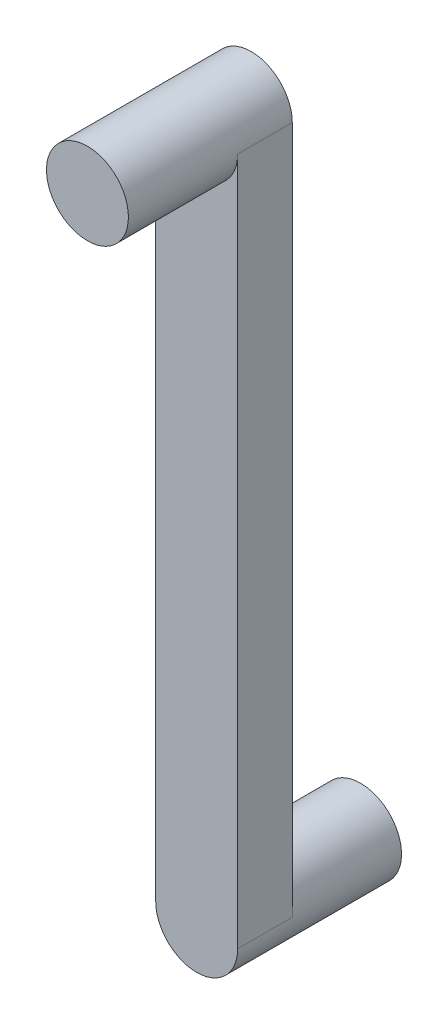
ISO-10303-21;
HEADER;
FILE_DESCRIPTION(('STEP AP214'),'2;1');
FILE_NAME('part.step','',(''),(''),'','','');
FILE_SCHEMA(('AUTOMOTIVE_DESIGN { 1 0 10303 214 1 1 1 1 }'));
ENDSEC;
DATA;
#1=APPLICATION_CONTEXT('core data for automotive mechanical design processes');
#2=APPLICATION_PROTOCOL_DEFINITION('international standard','automotive_design',2000,#1);
#3=PRODUCT_CONTEXT('',#1,'mechanical');
#4=PRODUCT('Part','Part','',(#3));
#5=PRODUCT_RELATED_PRODUCT_CATEGORY('part','',(#4));
#6=PRODUCT_DEFINITION_FORMATION('','',#4);
#7=PRODUCT_DEFINITION_CONTEXT('part definition',#1,'design');
#8=PRODUCT_DEFINITION('design','',#6,#7);
#9=PRODUCT_DEFINITION_SHAPE('','',#8);
#10=(LENGTH_UNIT() NAMED_UNIT(*) SI_UNIT(.MILLI.,.METRE.));
#11=(NAMED_UNIT(*) PLANE_ANGLE_UNIT() SI_UNIT($,.RADIAN.));
#12=(NAMED_UNIT(*) SI_UNIT($,.STERADIAN.) SOLID_ANGLE_UNIT());
#13=UNCERTAINTY_MEASURE_WITH_UNIT(LENGTH_MEASURE(1.E-05),#10,'distance_accuracy_value','');
#14=(GEOMETRIC_REPRESENTATION_CONTEXT(3) GLOBAL_UNCERTAINTY_ASSIGNED_CONTEXT((#13)) GLOBAL_UNIT_ASSIGNED_CONTEXT((#10,
#11,#12)) REPRESENTATION_CONTEXT('',''));
#15=CARTESIAN_POINT('',(0.,0.,0.));
#16=DIRECTION('',(0.,0.,1.));
#17=DIRECTION('',(1.,0.,0.));
#18=AXIS2_PLACEMENT_3D('',#15,#16,#17);
#19=CARTESIAN_POINT('',(0.,-126.,0.));
#20=DIRECTION('',(0.,0.,1.));
#21=DIRECTION('',(1.,0.,0.));
#22=AXIS2_PLACEMENT_3D('',#19,#20,#21);
#23=PLANE('',#22);
#24=CARTESIAN_POINT('',(0.,-126.,0.));
#25=DIRECTION('',(0.,0.,-1.));
#26=DIRECTION('',(-1.,0.,0.));
#27=AXIS2_PLACEMENT_3D('',#24,#25,#26);
#28=CIRCLE('',#27,7.5);
#29=CARTESIAN_POINT('',(-7.49999999999998,-126.,0.));
#30=VERTEX_POINT('',#29);
#31=CARTESIAN_POINT('',(7.50000000000002,-126.,0.));
#32=VERTEX_POINT('',#31);
#33=EDGE_CURVE('E81',#30,#32,#28,.T.);
#34=ORIENTED_EDGE('',*,*,#33,.F.);
#35=DIRECTION('',(0.,-1.,0.));
#36=VECTOR('',#35,1.);
#37=CARTESIAN_POINT('',(-7.5,0.,0.));
#38=LINE('',#37,#36);
#39=CARTESIAN_POINT('',(-7.5,0.,0.));
#40=VERTEX_POINT('',#39);
#41=EDGE_CURVE('E83',#40,#30,#38,.T.);
#42=ORIENTED_EDGE('',*,*,#41,.F.);
#43=CARTESIAN_POINT('',(0.,0.,0.));
#44=DIRECTION('',(0.,0.,1.));
#45=DIRECTION('',(1.,0.,0.));
#46=AXIS2_PLACEMENT_3D('',#43,#44,#45);
#47=CIRCLE('',#46,7.5);
#48=CARTESIAN_POINT('',(7.5,0.,0.));
#49=VERTEX_POINT('',#48);
#50=EDGE_CURVE('E67',#49,#40,#47,.T.);
#51=ORIENTED_EDGE('',*,*,#50,.F.);
#52=DIRECTION('',(0.,-1.,0.));
#53=VECTOR('',#52,1.);
#54=CARTESIAN_POINT('',(7.5,0.,0.));
#55=LINE('',#54,#53);
#56=EDGE_CURVE('E85',#49,#32,#55,.T.);
#57=ORIENTED_EDGE('',*,*,#56,.T.);
#58=EDGE_LOOP('',(#34,#42,#51,#57));
#59=FACE_BOUND('',#58,.T.);
#60=ADVANCED_FACE('F36',(#59),#23,.F.);
#61=CARTESIAN_POINT('',(7.5,0.,10.));
#62=DIRECTION('',(1.,0.,0.));
#63=DIRECTION('',(0.,1.,0.));
#64=AXIS2_PLACEMENT_3D('',#61,#62,#63);
#65=PLANE('',#64);
#66=ORIENTED_EDGE('',*,*,#56,.F.);
#67=DIRECTION('',(0.,0.,-1.));
#68=VECTOR('',#67,1.);
#69=CARTESIAN_POINT('',(7.5,0.,10.));
#70=LINE('',#69,#68);
#71=CARTESIAN_POINT('',(7.5,0.,10.));
#72=VERTEX_POINT('',#71);
#73=EDGE_CURVE('E46',#72,#49,#70,.T.);
#74=ORIENTED_EDGE('',*,*,#73,.F.);
#75=DIRECTION('',(0.,-1.,0.));
#76=VECTOR('',#75,1.);
#77=CARTESIAN_POINT('',(7.5,0.,10.));
#78=LINE('',#77,#76);
#79=CARTESIAN_POINT('',(7.50000000000002,-126.,10.));
#80=VERTEX_POINT('',#79);
#81=EDGE_CURVE('E104',#72,#80,#78,.T.);
#82=ORIENTED_EDGE('',*,*,#81,.T.);
#83=DIRECTION('',(0.,0.,-1.));
#84=VECTOR('',#83,1.);
#85=CARTESIAN_POINT('',(7.50000000000002,-126.,10.));
#86=LINE('',#85,#84);
#87=EDGE_CURVE('E40',#80,#32,#86,.T.);
#88=ORIENTED_EDGE('',*,*,#87,.T.);
#89=EDGE_LOOP('',(#66,#74,#82,#88));
#90=FACE_BOUND('',#89,.T.);
#91=ADVANCED_FACE('F38',(#90),#65,.T.);
#92=CARTESIAN_POINT('',(0.,0.,10.));
#93=DIRECTION('',(0.,0.,-1.));
#94=DIRECTION('',(-1.,0.,0.));
#95=AXIS2_PLACEMENT_3D('',#92,#93,#94);
#96=CYLINDRICAL_SURFACE('',#95,7.5);
#97=ORIENTED_EDGE('',*,*,#50,.T.);
#98=DIRECTION('',(0.,0.,-1.));
#99=VECTOR('',#98,1.);
#100=CARTESIAN_POINT('',(-7.5,0.,10.));
#101=LINE('',#100,#99);
#102=CARTESIAN_POINT('',(-7.5,0.,10.));
#103=VERTEX_POINT('',#102);
#104=EDGE_CURVE('E96',#103,#40,#101,.T.);
#105=ORIENTED_EDGE('',*,*,#104,.F.);
#106=CARTESIAN_POINT('',(0.,0.,10.));
#107=DIRECTION('',(0.,0.,1.));
#108=DIRECTION('',(1.,0.,0.));
#109=AXIS2_PLACEMENT_3D('',#106,#107,#108);
#110=CIRCLE('',#109,7.5);
#111=EDGE_CURVE('E11',#103,#72,#110,.T.);
#112=ORIENTED_EDGE('',*,*,#111,.T.);
#113=ORIENTED_EDGE('',*,*,#73,.T.);
#114=EDGE_LOOP('',(#97,#105,#112,#113));
#115=FACE_BOUND('',#114,.T.);
#116=CARTESIAN_POINT('',(0.,0.,30.));
#117=DIRECTION('',(0.,0.,1.));
#118=DIRECTION('',(1.,0.,0.));
#119=AXIS2_PLACEMENT_3D('',#116,#117,#118);
#120=CIRCLE('',#119,7.5);
#121=CARTESIAN_POINT('',(7.5,0.,30.));
#122=VERTEX_POINT('',#121);
#123=EDGE_CURVE('E107',#122,#122,#120,.T.);
#124=ORIENTED_EDGE('',*,*,#123,.F.);
#125=EDGE_LOOP('',(#124));
#126=FACE_BOUND('',#125,.T.);
#127=ADVANCED_FACE('F126',(#115,#126),#96,.T.);
#128=CARTESIAN_POINT('',(-7.5,0.,10.));
#129=DIRECTION('',(1.,0.,0.));
#130=DIRECTION('',(0.,1.,0.));
#131=AXIS2_PLACEMENT_3D('',#128,#129,#130);
#132=PLANE('',#131);
#133=ORIENTED_EDGE('',*,*,#41,.T.);
#134=DIRECTION('',(0.,0.,-1.));
#135=VECTOR('',#134,1.);
#136=CARTESIAN_POINT('',(-7.49999999999998,-126.,10.));
#137=LINE('',#136,#135);
#138=CARTESIAN_POINT('',(-7.49999999999998,-126.,10.));
#139=VERTEX_POINT('',#138);
#140=EDGE_CURVE('E95',#139,#30,#137,.T.);
#141=ORIENTED_EDGE('',*,*,#140,.F.);
#142=DIRECTION('',(0.,-1.,0.));
#143=VECTOR('',#142,1.);
#144=CARTESIAN_POINT('',(-7.5,0.,10.));
#145=LINE('',#144,#143);
#146=EDGE_CURVE('E101',#103,#139,#145,.T.);
#147=ORIENTED_EDGE('',*,*,#146,.F.);
#148=ORIENTED_EDGE('',*,*,#104,.T.);
#149=EDGE_LOOP('',(#133,#141,#147,#148));
#150=FACE_BOUND('',#149,.T.);
#151=ADVANCED_FACE('F93',(#150),#132,.F.);
#152=CARTESIAN_POINT('',(0.,-126.,10.));
#153=DIRECTION('',(0.,0.,-1.));
#154=DIRECTION('',(-1.,0.,0.));
#155=AXIS2_PLACEMENT_3D('',#152,#153,#154);
#156=CYLINDRICAL_SURFACE('',#155,7.5);
#157=ORIENTED_EDGE('',*,*,#140,.T.);
#158=ORIENTED_EDGE('',*,*,#33,.T.);
#159=ORIENTED_EDGE('',*,*,#87,.F.);
#160=CARTESIAN_POINT('',(0.,-126.,10.));
#161=DIRECTION('',(0.,0.,1.));
#162=DIRECTION('',(1.,0.,0.));
#163=AXIS2_PLACEMENT_3D('',#160,#161,#162);
#164=CIRCLE('',#163,7.5);
#165=EDGE_CURVE('E72',#139,#80,#164,.T.);
#166=ORIENTED_EDGE('',*,*,#165,.F.);
#167=EDGE_LOOP('',(#157,#158,#159,#166));
#168=FACE_BOUND('',#167,.T.);
#169=CARTESIAN_POINT('',(0.,-126.,-20.));
#170=DIRECTION('',(0.,0.,-1.));
#171=DIRECTION('',(-1.,0.,0.));
#172=AXIS2_PLACEMENT_3D('',#169,#170,#171);
#173=CIRCLE('',#172,7.5);
#174=CARTESIAN_POINT('',(-7.49999999999998,-126.,-20.));
#175=VERTEX_POINT('',#174);
#176=EDGE_CURVE('E89',#175,#175,#173,.T.);
#177=ORIENTED_EDGE('',*,*,#176,.F.);
#178=EDGE_LOOP('',(#177));
#179=FACE_BOUND('',#178,.T.);
#180=ADVANCED_FACE('F98',(#168,#179),#156,.T.);
#181=CARTESIAN_POINT('',(0.,-126.,10.));
#182=DIRECTION('',(0.,0.,1.));
#183=DIRECTION('',(1.,0.,0.));
#184=AXIS2_PLACEMENT_3D('',#181,#182,#183);
#185=PLANE('',#184);
#186=ORIENTED_EDGE('',*,*,#111,.F.);
#187=ORIENTED_EDGE('',*,*,#146,.T.);
#188=ORIENTED_EDGE('',*,*,#165,.T.);
#189=ORIENTED_EDGE('',*,*,#81,.F.);
#190=EDGE_LOOP('',(#186,#187,#188,#189));
#191=FACE_BOUND('',#190,.T.);
#192=ADVANCED_FACE('F119',(#191),#185,.T.);
#193=CARTESIAN_POINT('',(0.,0.,30.));
#194=DIRECTION('',(0.,0.,1.));
#195=DIRECTION('',(1.,0.,0.));
#196=AXIS2_PLACEMENT_3D('',#193,#194,#195);
#197=PLANE('',#196);
#198=ORIENTED_EDGE('',*,*,#123,.T.);
#199=EDGE_LOOP('',(#198));
#200=FACE_BOUND('',#199,.T.);
#201=ADVANCED_FACE('F124',(#200),#197,.T.);
#202=CARTESIAN_POINT('',(0.,-126.,-20.));
#203=DIRECTION('',(0.,0.,-1.));
#204=DIRECTION('',(-1.,0.,0.));
#205=AXIS2_PLACEMENT_3D('',#202,#203,#204);
#206=PLANE('',#205);
#207=ORIENTED_EDGE('',*,*,#176,.T.);
#208=EDGE_LOOP('',(#207));
#209=FACE_BOUND('',#208,.T.);
#210=ADVANCED_FACE('F117',(#209),#206,.T.);
#211=CLOSED_SHELL('',(#60,#91,#127,#151,#180,#192,#201,#210));
#212=MANIFOLD_SOLID_BREP('B2',#211);
#213=ADVANCED_BREP_SHAPE_REPRESENTATION('',(#18,#212),#14);
#214=SHAPE_DEFINITION_REPRESENTATION(#9,#213);
ENDSEC;
END-ISO-10303-21;
